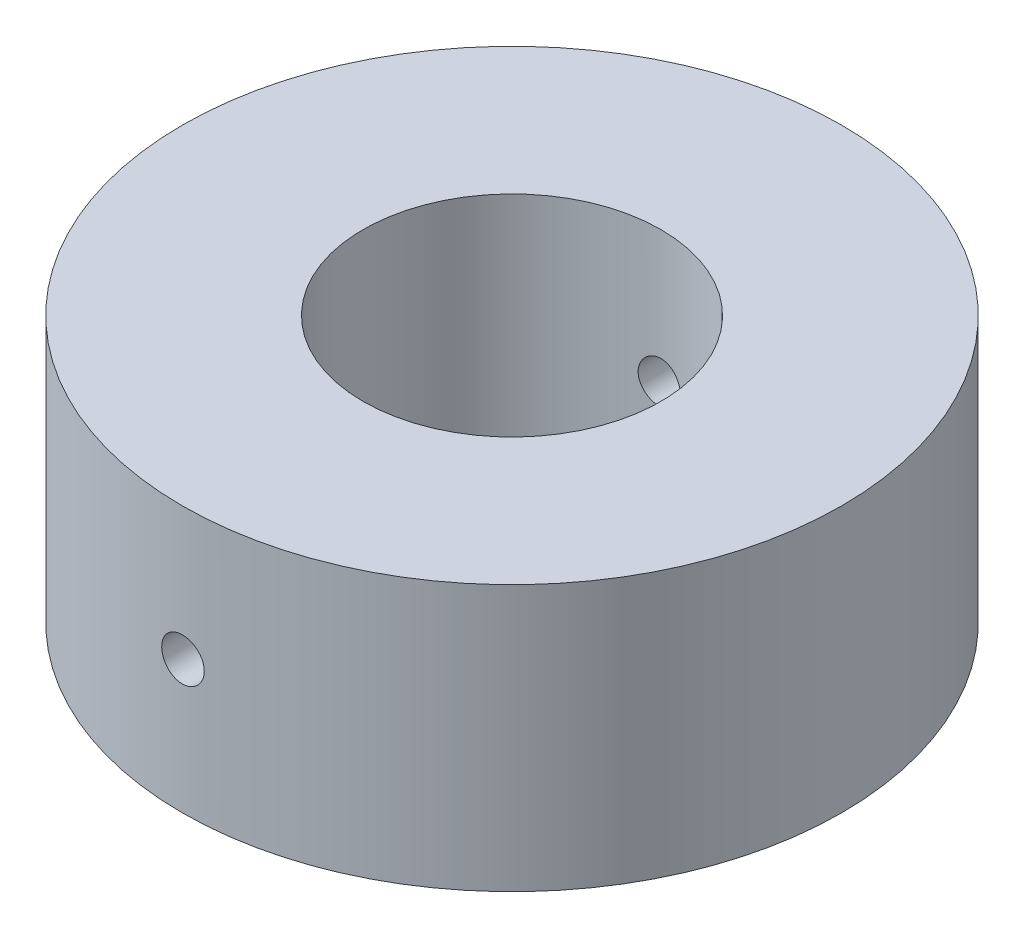
ISO-10303-21;
HEADER;
FILE_DESCRIPTION(('STEP AP214'),'2;1');
FILE_NAME('part.step','',(''),(''),'','','');
FILE_SCHEMA(('AUTOMOTIVE_DESIGN { 1 0 10303 214 1 1 1 1 }'));
ENDSEC;
DATA;
#1=APPLICATION_CONTEXT('core data for automotive mechanical design processes');
#2=APPLICATION_PROTOCOL_DEFINITION('international standard','automotive_design',2000,#1);
#3=PRODUCT_CONTEXT('',#1,'mechanical');
#4=PRODUCT('Part','Part','',(#3));
#5=PRODUCT_RELATED_PRODUCT_CATEGORY('part','',(#4));
#6=PRODUCT_DEFINITION_FORMATION('','',#4);
#7=PRODUCT_DEFINITION_CONTEXT('part definition',#1,'design');
#8=PRODUCT_DEFINITION('design','',#6,#7);
#9=PRODUCT_DEFINITION_SHAPE('','',#8);
#10=(LENGTH_UNIT() NAMED_UNIT(*) SI_UNIT(.MILLI.,.METRE.));
#11=(NAMED_UNIT(*) PLANE_ANGLE_UNIT() SI_UNIT($,.RADIAN.));
#12=(NAMED_UNIT(*) SI_UNIT($,.STERADIAN.) SOLID_ANGLE_UNIT());
#13=UNCERTAINTY_MEASURE_WITH_UNIT(LENGTH_MEASURE(1.E-05),#10,'distance_accuracy_value','');
#14=(GEOMETRIC_REPRESENTATION_CONTEXT(3) GLOBAL_UNCERTAINTY_ASSIGNED_CONTEXT((#13)) GLOBAL_UNIT_ASSIGNED_CONTEXT((#10,
#11,#12)) REPRESENTATION_CONTEXT('',''));
#15=CARTESIAN_POINT('',(0.,0.,0.));
#16=DIRECTION('',(0.,0.,1.));
#17=DIRECTION('',(1.,0.,0.));
#18=AXIS2_PLACEMENT_3D('',#15,#16,#17);
#19=CARTESIAN_POINT('',(0.,-12.5,0.));
#20=DIRECTION('',(0.,1.,0.));
#21=DIRECTION('',(0.,0.,1.));
#22=AXIS2_PLACEMENT_3D('',#19,#20,#21);
#23=PLANE('',#22);
#24=CARTESIAN_POINT('',(0.,-12.5,0.));
#25=DIRECTION('',(0.,1.,0.));
#26=DIRECTION('',(0.,0.,1.));
#27=AXIS2_PLACEMENT_3D('',#24,#25,#26);
#28=CIRCLE('',#27,31.);
#29=CARTESIAN_POINT('',(0.,-12.5,31.));
#30=VERTEX_POINT('',#29);
#31=EDGE_CURVE('E108',#30,#30,#28,.T.);
#32=ORIENTED_EDGE('',*,*,#31,.F.);
#33=EDGE_LOOP('',(#32));
#34=FACE_BOUND('',#33,.T.);
#35=CARTESIAN_POINT('',(0.,-12.5,0.));
#36=DIRECTION('',(0.,-1.,0.));
#37=DIRECTION('',(0.,0.,-1.));
#38=AXIS2_PLACEMENT_3D('',#35,#36,#37);
#39=CIRCLE('',#38,15.025);
#40=CARTESIAN_POINT('',(0.,-12.5,-15.025));
#41=VERTEX_POINT('',#40);
#42=EDGE_CURVE('E111',#41,#41,#39,.T.);
#43=ORIENTED_EDGE('',*,*,#42,.F.);
#44=EDGE_LOOP('',(#43));
#45=FACE_BOUND('',#44,.T.);
#46=ADVANCED_FACE('F49',(#34,#45),#23,.F.);
#47=CARTESIAN_POINT('',(0.,0.,-31.));
#48=DIRECTION('',(0.,0.,1.));
#49=DIRECTION('',(1.,0.,0.));
#50=AXIS2_PLACEMENT_3D('',#47,#48,#49);
#51=CYLINDRICAL_SURFACE('',#50,2.);
#52=CARTESIAN_POINT('',(2.,0.,-13.856406460551));
#53=CARTESIAN_POINT('',(1.99999534115949,0.111724171239718,-13.8564082571265));
#54=CARTESIAN_POINT('',(1.99060664506871,0.223514712772157,-13.8577723197261));
#55=CARTESIAN_POINT('',(1.95330740137887,0.4439746364233,-13.8630779913067));
#56=CARTESIAN_POINT('',(1.92537839621705,0.552640795515153,-13.8670221688303));
#57=CARTESIAN_POINT('',(1.85184738836467,0.763628700028854,-13.8770324264324));
#58=CARTESIAN_POINT('',(1.80625847122079,0.865955078100517,-13.8830969350759));
#59=CARTESIAN_POINT('',(1.69873175889211,1.06148972946806,-13.8966626659811));
#60=CARTESIAN_POINT('',(1.63679637900725,1.15469934704029,-13.9041636759451));
#61=CARTESIAN_POINT('',(1.49785346840196,1.33004829584733,-13.9198182525555));
#62=CARTESIAN_POINT('',(1.42075056427329,1.41211171386589,-13.9279757447273));
#63=CARTESIAN_POINT('',(1.25386707896715,1.56218155724058,-13.9439890311844));
#64=CARTESIAN_POINT('',(1.16408582185113,1.63018723264027,-13.9518448093556));
#65=CARTESIAN_POINT('',(0.973910384020492,1.75048909775968,-13.9664103702289));
#66=CARTESIAN_POINT('',(0.873471766216093,1.80271571451843,-13.9731150229347));
#67=CARTESIAN_POINT('',(0.665136745963097,1.88953073532782,-13.9845795145291));
#68=CARTESIAN_POINT('',(0.55724070203933,1.92411998664739,-13.9893394468364));
#69=CARTESIAN_POINT('',(0.337834063540951,1.97444920696427,-13.9963505000898));
#70=CARTESIAN_POINT('',(0.226353125069878,1.99031606996624,-13.9986185031811));
#71=CARTESIAN_POINT('',(0.00228956527839891,2.0031438985666,-14.0004479548383));
#72=CARTESIAN_POINT('',(-0.110292999940579,2.00010582196611,-14.0000095405223));
#73=CARTESIAN_POINT('',(-0.33249899218587,1.97531062178419,-13.9964890946326));
#74=CARTESIAN_POINT('',(-0.442137999771035,1.95369000111749,-13.9934263413243));
#75=CARTESIAN_POINT('',(-0.656215595128694,1.89255744030079,-13.9850228541263));
#76=CARTESIAN_POINT('',(-0.760654059261884,1.8530450750122,-13.9796820661069));
#77=CARTESIAN_POINT('',(-0.961781966767738,1.75710925521643,-13.9672894037098));
#78=CARTESIAN_POINT('',(-1.05844339279107,1.70062784888116,-13.9602316817171));
#79=CARTESIAN_POINT('',(-1.24096782013765,1.57239950725974,-13.9451926669623));
#80=CARTESIAN_POINT('',(-1.32683017541183,1.50065165935678,-13.9372113189995));
#81=CARTESIAN_POINT('',(-1.48612299106386,1.34316539832401,-13.921132049438));
#82=CARTESIAN_POINT('',(-1.55943569332184,1.25730786725081,-13.9130337231123));
#83=CARTESIAN_POINT('',(-1.69062989590123,1.07444547857052,-13.8977029387566));
#84=CARTESIAN_POINT('',(-1.74851131716179,0.977440563854387,-13.890470485163));
#85=CARTESIAN_POINT('',(-1.84721301520795,0.774919710093822,-13.8776905368292));
#86=CARTESIAN_POINT('',(-1.88802200251778,0.669398194117397,-13.8721441576987));
#87=CARTESIAN_POINT('',(-1.9513062370832,0.452902420174113,-13.8633846580895));
#88=CARTESIAN_POINT('',(-1.97378265080303,0.341928509608439,-13.8601713891613));
#89=CARTESIAN_POINT('',(-1.99960390688194,0.118723462569961,-13.8564698075732));
#90=CARTESIAN_POINT('',(-2.00311531104472,0.0065119740044162,-13.8559577720311));
#91=CARTESIAN_POINT('',(-1.99134808247121,-0.21689780502515,-13.8576537253271));
#92=CARTESIAN_POINT('',(-1.9760699768337,-0.328096123823289,-13.8598616378631));
#93=CARTESIAN_POINT('',(-1.92729837855201,-0.545812180028446,-13.8667269652516));
#94=CARTESIAN_POINT('',(-1.89388715844421,-0.652348727065341,-13.8713733134525));
#95=CARTESIAN_POINT('',(-1.80988306171463,-0.858308797456496,-13.8825829121217));
#96=CARTESIAN_POINT('',(-1.75928940970141,-0.957731999561724,-13.8891462490961));
#97=CARTESIAN_POINT('',(-1.64195360331226,-1.14739187972149,-13.9035064841342));
#98=CARTESIAN_POINT('',(-1.57510320027125,-1.23756096121236,-13.911311524523));
#99=CARTESIAN_POINT('',(-1.42730277821365,-1.40545972362551,-13.9272509086593));
#100=CARTESIAN_POINT('',(-1.34635203820216,-1.48318876805913,-13.9353852692295));
#101=CARTESIAN_POINT('',(-1.17191708628535,-1.6245952184338,-13.9511405241391));
#102=CARTESIAN_POINT('',(-1.07834317212433,-1.68816252231952,-13.9587570956185));
#103=CARTESIAN_POINT('',(-0.881748704771194,-1.79867556313572,-13.972552215598));
#104=CARTESIAN_POINT('',(-0.778728390176455,-1.84562171973795,-13.9787308004049));
#105=CARTESIAN_POINT('',(-0.566515924593931,-1.92138211431572,-13.9889347784444));
#106=CARTESIAN_POINT('',(-0.457345999123928,-1.95025758862749,-13.9929674365722));
#107=CARTESIAN_POINT('',(-0.235645259045785,-1.98925546710661,-13.9984555911653));
#108=CARTESIAN_POINT('',(-0.123114645314278,-1.99937898985385,-13.9999112413524));
#109=CARTESIAN_POINT('',(0.101043130627157,-2.00056023894447,-14.0000800767192));
#110=CARTESIAN_POINT('',(0.212669421750584,-1.99178681901844,-13.9988175502239));
#111=CARTESIAN_POINT('',(0.432842633479872,-1.95578384995697,-13.9937406427504));
#112=CARTESIAN_POINT('',(0.541389561355442,-1.92855434439613,-13.989926267797));
#113=CARTESIAN_POINT('',(0.752283714497251,-1.85647002257181,-13.9801722205425));
#114=CARTESIAN_POINT('',(0.854634630206985,-1.81162581951526,-13.9742338281966));
#115=CARTESIAN_POINT('',(1.05038570585148,-1.70560285079797,-13.9608856010229));
#116=CARTESIAN_POINT('',(1.14378562996655,-1.64442365494189,-13.9534757274438));
#117=CARTESIAN_POINT('',(1.31984194960265,-1.50685228477663,-13.9379304746346));
#118=CARTESIAN_POINT('',(1.40240016631986,-1.4303350931675,-13.9297894585903));
#119=CARTESIAN_POINT('',(1.55356716727243,-1.2645224397647,-13.9137422342621));
#120=CARTESIAN_POINT('',(1.6221726663073,-1.17522397700347,-13.9058360816507));
#121=CARTESIAN_POINT('',(1.74379523475593,-0.985854561664355,-13.8911108785174));
#122=CARTESIAN_POINT('',(1.79673154300995,-0.885731309588877,-13.8842975402726));
#123=CARTESIAN_POINT('',(1.88495902507096,-0.67796770339548,-13.8725962813595));
#124=CARTESIAN_POINT('',(1.92026877922144,-0.570335401682811,-13.8677063343816));
#125=CARTESIAN_POINT('',(1.96409255165575,-0.385163574169463,-13.8615529221772));
#126=CARTESIAN_POINT('',(1.97753762529532,-0.308775664589437,-13.859633039894));
#127=CARTESIAN_POINT('',(1.99549291508544,-0.154935803034168,-13.857059193163));
#128=CARTESIAN_POINT('',(2.00000323103726,-0.0774838629538774,-13.8564052145753));
#129=CARTESIAN_POINT('',(2.,0.,-13.856406460551));
#130=B_SPLINE_CURVE_WITH_KNOTS('',3,(#52,#53,#54,#55,#56,#57,#58,#59,#60,#61,#62,#63,#64,#65,
#66,#67,#68,#69,#70,#71,#72,#73,#74,#75,#76,#77,#78,#79,#80,#81,#82,#83,#84,#85,#86,#87,#88,#89,
#90,#91,#92,#93,#94,#95,#96,#97,#98,#99,#100,#101,#102,#103,#104,#105,#106,#107,#108,#109,#110,
#111,#112,#113,#114,#115,#116,#117,#118,#119,#120,#121,#122,#123,#124,#125,#126,#127,#128,#129),
.UNSPECIFIED.,.T.,.F.,(4,2,2,2,2,2,2,2,2,2,2,2,2,2,2,2,2,2,2,2,2,2,2,2,2,2,2,2,2,2,2,2,2,2,2,2,
2,2,4),(0.,0.334889349408973,0.670112594526281,1.00508792139358,1.34001378108308,
1.6771171564902,2.01423851114537,2.35282530676003,2.6913958357102,3.02765822138618,
3.36390357078099,3.69769984907442,4.03150405935711,4.36646147641386,4.70143892261039,
5.03940517986243,5.37737316862278,5.7155642933107,6.05373389790875,6.3889286108256,
6.72411392079905,7.05779100804298,7.39148315513125,7.72746121011463,8.06345644976601,
8.40197921522166,8.74049343261658,9.07785422138908,9.41519488547502,9.74953375304066,
10.083871831239,10.4180087723112,10.7521545140199,11.0891434930866,11.426211725383,
11.7649881551454,12.103406718889,12.3356645196522,12.5679197260806),.UNSPECIFIED.);
#131=CARTESIAN_POINT('',(2.,0.,-13.856406460551));
#132=VERTEX_POINT('',#131);
#133=EDGE_CURVE('E54',#132,#132,#130,.T.);
#134=ORIENTED_EDGE('',*,*,#133,.T.);
#135=EDGE_LOOP('',(#134));
#136=FACE_BOUND('',#135,.T.);
#137=CARTESIAN_POINT('',(0.,2.,-31.));
#138=CARTESIAN_POINT('',(-0.112215654339317,1.99999506535687,-30.9999991433593));
#139=CARTESIAN_POINT('',(-0.224509697755792,1.99052399692905,-30.9993841781378));
#140=CARTESIAN_POINT('',(-0.445996563839363,1.95287826523691,-30.9969900822698));
#141=CARTESIAN_POINT('',(-0.555185631317145,1.92468188148123,-30.995209599712));
#142=CARTESIAN_POINT('',(-0.767222273353349,1.85039922266924,-30.9906858712334));
#143=CARTESIAN_POINT('',(-0.870073180121544,1.804322442615,-30.9879431363702));
#144=CARTESIAN_POINT('',(-1.06655419121177,1.69560247432647,-30.9818033083145));
#145=CARTESIAN_POINT('',(-1.16018638881332,1.63296305890811,-30.9784063641926));
#146=CARTESIAN_POINT('',(-1.33574735149226,1.49278721689289,-30.9713338678515));
#147=CARTESIAN_POINT('',(-1.41765955134849,1.41523006107196,-30.9676579323087));
#148=CARTESIAN_POINT('',(-1.56731361668946,1.24746315936059,-30.9604450194385));
#149=CARTESIAN_POINT('',(-1.63505488757192,1.15725288281922,-30.9569080479471));
#150=CARTESIAN_POINT('',(-1.75449583012476,0.966645876772271,-30.9503689553142));
#151=CARTESIAN_POINT('',(-1.80618164293255,0.866240445574872,-30.9473672971948));
#152=CARTESIAN_POINT('',(-1.89195583963109,0.658154240871173,-30.9422423248965));
#153=CARTESIAN_POINT('',(-1.92604442295615,0.550473549833064,-30.9401190007632));
#154=CARTESIAN_POINT('',(-1.97561027708406,0.331053889731196,-30.9369938163707));
#155=CARTESIAN_POINT('',(-1.99111363037516,0.219320835321083,-30.9359903845927));
#156=CARTESIAN_POINT('',(-2.00314946286492,-0.0051658867761137,-30.9352134372475));
#157=CARTESIAN_POINT('',(-1.99968216879705,-0.117919542249094,-30.9354399069807));
#158=CARTESIAN_POINT('',(-1.97389676609058,-0.341068993309128,-30.9370957648353));
#159=CARTESIAN_POINT('',(-1.95160689250421,-0.451468066745859,-30.9385233511946));
#160=CARTESIAN_POINT('',(-1.88885285922539,-0.666954436312708,-30.9424177285383));
#161=CARTESIAN_POINT('',(-1.84838858481581,-0.772041698909924,-30.9448845260822));
#162=CARTESIAN_POINT('',(-1.75040236603017,-0.974012051523738,-30.950581411863));
#163=CARTESIAN_POINT('',(-1.69286762529808,-1.07088891657466,-30.9538120723364));
#164=CARTESIAN_POINT('',(-1.56238294303282,-1.25362043754488,-30.9606720468822));
#165=CARTESIAN_POINT('',(-1.48943281646507,-1.33947496114047,-30.9643013657397));
#166=CARTESIAN_POINT('',(-1.33002918024156,-1.49788897224725,-30.9715576661216));
#167=CARTESIAN_POINT('',(-1.24355123701299,-1.57042387657725,-30.9751846312538));
#168=CARTESIAN_POINT('',(-1.05963238065177,-1.69994998940823,-30.9820211258603));
#169=CARTESIAN_POINT('',(-0.96219146344964,-1.75694119213933,-30.9852306551797));
#170=CARTESIAN_POINT('',(-0.759097650104713,-1.85376009536345,-30.9908708984537));
#171=CARTESIAN_POINT('',(-0.653444302495537,-1.89358685147729,-30.993301569554));
#172=CARTESIAN_POINT('',(-0.43693145704657,-1.95492983719797,-30.9971096301203));
#173=CARTESIAN_POINT('',(-0.326072024003265,-1.97644629463654,-30.9984870326917));
#174=CARTESIAN_POINT('',(-0.102507175447048,-2.00052741791093,-31.0000316586496));
#175=CARTESIAN_POINT('',(0.010194564986633,-2.00312606946162,-31.0002010522052));
#176=CARTESIAN_POINT('',(0.234432325673386,-1.98938663363241,-30.9993163465974));
#177=CARTESIAN_POINT('',(0.345968352392935,-1.97304865135459,-30.9982622542246));
#178=CARTESIAN_POINT('',(0.564612747016006,-1.9219278659019,-30.9950506275521));
#179=CARTESIAN_POINT('',(0.671724778633497,-1.88716066890227,-30.9928940269301));
#180=CARTESIAN_POINT('',(0.878593779219436,-1.80018422535197,-30.9877199775486));
#181=CARTESIAN_POINT('',(0.978350677728702,-1.74797481173847,-30.9847025205438));
#182=CARTESIAN_POINT('',(1.1678332297321,-1.62750954769242,-30.9781403346066));
#183=CARTESIAN_POINT('',(1.25754443633822,-1.55923101448261,-30.9745948629635));
#184=CARTESIAN_POINT('',(1.42424356495627,-1.40859868348154,-30.967378088537));
#185=CARTESIAN_POINT('',(1.50123135368358,-1.32624473826119,-30.9637067844358));
#186=CARTESIAN_POINT('',(1.64041349295417,-1.14965261108097,-30.9566458285136));
#187=CARTESIAN_POINT('',(1.7025857840609,-1.05539702354022,-30.9532566015118));
#188=CARTESIAN_POINT('',(1.81022116069945,-0.857764592436426,-30.9471487879795));
#189=CARTESIAN_POINT('',(1.85568435473854,-0.75438780811097,-30.944430197094));
#190=CARTESIAN_POINT('',(1.92857285757611,-0.541527836801464,-30.9399733092594));
#191=CARTESIAN_POINT('',(1.95601201841901,-0.432049409492469,-30.9382342596483));
#192=CARTESIAN_POINT('',(1.99211878627912,-0.210027804712064,-30.9359304876033));
#193=CARTESIAN_POINT('',(2.00078659418242,-0.0974846600515063,-30.9353657526022));
#194=CARTESIAN_POINT('',(1.99910264494747,0.127252361480456,-30.9354746011268));
#195=CARTESIAN_POINT('',(1.98878556636566,0.239446500937189,-30.9361459268157));
#196=CARTESIAN_POINT('',(1.94949664150648,0.46050581969475,-30.938646462886));
#197=CARTESIAN_POINT('',(1.92052476179849,0.569370993029489,-30.9404756753424));
#198=CARTESIAN_POINT('',(1.84475653861325,0.780687053413475,-30.9450852959292));
#199=CARTESIAN_POINT('',(1.79796038157477,0.883138007541266,-30.9478656941104));
#200=CARTESIAN_POINT('',(1.68787663618787,1.07873362067521,-30.9540643267455));
#201=CARTESIAN_POINT('',(1.62458946071716,1.17187851259202,-30.95748254523));
#202=CARTESIAN_POINT('',(1.48319164247164,1.34639404083785,-30.9645789238549));
#203=CARTESIAN_POINT('',(1.40505584730704,1.42774427966753,-30.9682575183188));
#204=CARTESIAN_POINT('',(1.23621411924608,1.57620195213939,-30.9754563916217));
#205=CARTESIAN_POINT('',(1.1455051185099,1.64330589956448,-30.9789766315441));
#206=CARTESIAN_POINT('',(0.953982679662096,1.76141890870672,-30.9854660027973));
#207=CARTESIAN_POINT('',(0.853156370464058,1.81240711726672,-30.9884344180602));
#208=CARTESIAN_POINT('',(0.644427767747333,1.89666848162457,-30.9934761838017));
#209=CARTESIAN_POINT('',(0.536533915357341,1.92996235248338,-30.9955505803825));
#210=CARTESIAN_POINT('',(0.356651594381852,1.96925124704238,-30.9980279003735));
#211=CARTESIAN_POINT('',(0.285825407491095,1.98076708436121,-30.9987641443571));
#212=CARTESIAN_POINT('',(0.143343476839127,1.99614303138479,-30.9997504674376));
#213=CARTESIAN_POINT('',(0.0716877343082421,2.00000315244239,-31.0000005472555));
#214=CARTESIAN_POINT('',(0.,2.,-31.));
#215=B_SPLINE_CURVE_WITH_KNOTS('',3,(#137,#138,#139,#140,#141,#142,#143,#144,#145,#146,#147,
#148,#149,#150,#151,#152,#153,#154,#155,#156,#157,#158,#159,#160,#161,#162,#163,#164,#165,#166,
#167,#168,#169,#170,#171,#172,#173,#174,#175,#176,#177,#178,#179,#180,#181,#182,#183,#184,#185,
#186,#187,#188,#189,#190,#191,#192,#193,#194,#195,#196,#197,#198,#199,#200,#201,#202,#203,#204,
#205,#206,#207,#208,#209,#210,#211,#212,#213,#214),.UNSPECIFIED.,.T.,.F.,(4,2,2,2,2,2,2,2,2,2,2,
2,2,2,2,2,2,2,2,2,2,2,2,2,2,2,2,2,2,2,2,2,2,2,2,2,2,2,4),(0.,0.336385257264421,
0.673161388839542,1.00975892684098,1.34627985697648,1.68327182913147,2.02027793839952,
2.35757414376299,2.69486652637059,3.031684997043,3.36849944213587,3.70480954006273,
4.04112176081471,4.37768672750882,4.71425573430237,5.05143981525635,5.38862402137422,
5.72582677682908,6.06302533646995,6.39961797126436,6.73620873791161,7.07251492800511,
7.40882433935654,7.74561135475004,8.08240189794396,8.41969081298249,8.75697753766028,
9.09400474250684,9.43102834055903,9.7674369287722,10.1038461198529,10.4402517922498,
10.7766490430285,11.113621287119,11.450675897049,11.7881648741284,12.1252578719076,
12.3401542056707,12.5550502207584),.UNSPECIFIED.);
#216=CARTESIAN_POINT('',(0.,2.,-31.));
#217=VERTEX_POINT('',#216);
#218=EDGE_CURVE('E10',#217,#217,#215,.T.);
#219=ORIENTED_EDGE('',*,*,#218,.F.);
#220=EDGE_LOOP('',(#219));
#221=FACE_BOUND('',#220,.T.);
#222=ADVANCED_FACE('F90',(#136,#221),#51,.F.);
#223=CARTESIAN_POINT('',(0.,12.5,0.));
#224=DIRECTION('',(0.,-1.,0.));
#225=DIRECTION('',(0.,0.,-1.));
#226=AXIS2_PLACEMENT_3D('',#223,#224,#225);
#227=CYLINDRICAL_SURFACE('',#226,31.);
#228=ORIENTED_EDGE('',*,*,#218,.T.);
#229=EDGE_LOOP('',(#228));
#230=FACE_BOUND('',#229,.T.);
#231=CARTESIAN_POINT('',(2.,0.,30.935416596516));
#232=CARTESIAN_POINT('',(1.9999950651086,-0.112215380274018,30.9354174598263));
#233=CARTESIAN_POINT('',(1.99052404137826,-0.224509150543306,30.9360337396535));
#234=CARTESIAN_POINT('',(1.95287850337883,-0.445995449071102,30.9384325324618));
#235=CARTESIAN_POINT('',(1.92468226768592,-0.555184221926338,30.9402163998208));
#236=CARTESIAN_POINT('',(1.85040004205521,-0.767220241139664,30.9447474731823));
#237=CARTESIAN_POINT('',(1.80432355417806,-0.870070822202982,30.947494167437));
#238=CARTESIAN_POINT('',(1.69560427382128,-1.0665512881791,30.95364075921));
#239=CARTESIAN_POINT('',(1.63296525343412,-1.16018326596018,30.9570405079479));
#240=CARTESIAN_POINT('',(1.49278980939589,-1.33574447939923,30.964116258183));
#241=CARTESIAN_POINT('',(1.41523256837066,-1.41765707960332,30.9677926412884));
#242=CARTESIAN_POINT('',(1.24746532849986,-1.56731191689312,30.9750038722733));
#243=CARTESIAN_POINT('',(1.15725480009166,-1.63505356060327,30.978538714221));
#244=CARTESIAN_POINT('',(0.966647575892431,-1.75449489103906,30.9850718865194));
#245=CARTESIAN_POINT('',(0.86624222169945,-1.80618078792872,30.988069754748));
#246=CARTESIAN_POINT('',(0.658156184429077,-1.89195516135706,30.9931871662127));
#247=CARTESIAN_POINT('',(0.550475583400461,-1.92604383631625,30.9953067193523));
#248=CARTESIAN_POINT('',(0.331056188607279,-1.97560988486416,30.9984260427323));
#249=CARTESIAN_POINT('',(0.219323311030999,-1.99111334795072,30.9994273825597));
#250=CARTESIAN_POINT('',(-0.00516306558923811,-2.00314946128935,31.0002027404449));
#251=CARTESIAN_POINT('',(-0.117916552481839,-1.99968233710906,30.999976773096));
#252=CARTESIAN_POINT('',(-0.341066758562419,-1.97389720121747,30.9983242869808));
#253=CARTESIAN_POINT('',(-0.451466735643611,-1.95160725360552,30.9968995555366));
#254=CARTESIAN_POINT('',(-0.666954874354031,-1.88885275820205,30.9930119874225));
#255=CARTESIAN_POINT('',(-0.772043002934536,-1.84838809734843,30.9905491442946));
#256=CARTESIAN_POINT('',(-0.974014396906491,-1.75040108286936,30.9848595560919));
#257=CARTESIAN_POINT('',(-1.07089148154328,-1.69286602379006,30.9816322423855));
#258=CARTESIAN_POINT('',(-1.25362330624744,-1.56238066445803,30.9747768773151));
#259=CARTESIAN_POINT('',(-1.33947791385398,-1.48943017898078,30.9711488211361));
#260=CARTESIAN_POINT('',(-1.49789151150326,-1.33002629083235,30.9638924303215));
#261=CARTESIAN_POINT('',(-1.57042599106083,-1.24354852718224,30.9602641072233));
#262=CARTESIAN_POINT('',(-1.69995133281391,-1.05963018049244,30.9534228462431));
#263=CARTESIAN_POINT('',(-1.75694218838106,-0.962189592777827,30.9502099085383));
#264=CARTESIAN_POINT('',(-1.85376084284193,-0.759095863019263,30.9445622747552));
#265=CARTESIAN_POINT('',(-1.89358758916401,-0.653442217786696,30.9421276264072));
#266=CARTESIAN_POINT('',(-1.95493046384886,-0.43692872627003,30.9383128117028));
#267=CARTESIAN_POINT('',(-1.97644682181494,-0.326068945286724,30.936932632124));
#268=CARTESIAN_POINT('',(-2.0005275707802,-0.102503943922515,30.935384882819));
#269=CARTESIAN_POINT('',(-2.00312604181521,0.0101975911755167,30.9352151325502));
#270=CARTESIAN_POINT('',(-1.98938631826897,0.234434897624129,30.9361016877302));
#271=CARTESIAN_POINT('',(-1.97304822877741,0.34597067544069,30.9371579863749));
#272=CARTESIAN_POINT('',(-1.92192748105391,0.564613877756942,30.9403756121162));
#273=CARTESIAN_POINT('',(-1.8871605360573,0.671724991175506,30.9425359977644));
#274=CARTESIAN_POINT('',(-1.80018490459517,0.878592267099568,30.9477175452393));
#275=CARTESIAN_POINT('',(-1.747976049591,0.978348358523185,30.9507387153836));
#276=CARTESIAN_POINT('',(-1.62751159980918,1.16783037459035,30.9573066672382));
#277=CARTESIAN_POINT('',(-1.55923318016581,1.25754176197363,30.9608541939005));
#278=CARTESIAN_POINT('',(-1.40860097350461,1.42424130835709,30.9680724918238));
#279=CARTESIAN_POINT('',(-1.32624703991388,1.50122933484836,30.971743264368));
#280=CARTESIAN_POINT('',(-1.14965480608523,1.64041196801604,30.978800801216));
#281=CARTESIAN_POINT('',(-1.05539909876503,1.70258451359321,30.9821871371824));
#282=CARTESIAN_POINT('',(-0.857766362133938,1.81022033712454,30.9882880741929));
#283=CARTESIAN_POINT('',(-0.754389392075748,1.85568372361327,30.9910026796002));
#284=CARTESIAN_POINT('',(-0.541529554165107,1.92857235817444,30.995452244892));
#285=CARTESIAN_POINT('',(-0.432051474572318,1.95601154157408,30.9971879614524));
#286=CARTESIAN_POINT('',(-0.210030601522678,1.9921184724407,30.9994871962382));
#287=CARTESIAN_POINT('',(-0.0974878405751338,2.00078641894939,31.0000507268929));
#288=CARTESIAN_POINT('',(0.127249434817581,1.99910286557703,30.9999421302566));
#289=CARTESIAN_POINT('',(0.239444210521209,1.98878587873795,30.9992722452123));
#290=CARTESIAN_POINT('',(0.460504824177758,1.94949691314283,30.996776591382));
#291=CARTESIAN_POINT('',(0.569370656367646,1.92052490209332,30.9949508205951));
#292=CARTESIAN_POINT('',(0.780688007245924,1.84475617702917,30.9903485785737));
#293=CARTESIAN_POINT('',(0.883139592421462,1.79795964781096,30.9875721171954));
#294=CARTESIAN_POINT('',(1.07873631173732,1.68787496339571,30.981380132641));
#295=CARTESIAN_POINT('',(1.17188167917674,1.62458722176319,30.9779646254913));
#296=CARTESIAN_POINT('',(1.34639715713101,1.48318879026244,30.9708712939515));
#297=CARTESIAN_POINT('',(1.42774697433475,1.40505307681295,30.9671930333646));
#298=CARTESIAN_POINT('',(1.57620383440594,1.23621168433263,30.9599922696012));
#299=CARTESIAN_POINT('',(1.64330738996597,1.14550293654076,30.9564698047282));
#300=CARTESIAN_POINT('',(1.76141998814996,0.953980694172997,30.9499743793539));
#301=CARTESIAN_POINT('',(1.81240810435309,0.853154283366623,30.9470021353891));
#302=CARTESIAN_POINT('',(1.89666926769398,0.644425463254457,30.9419528171104));
#303=CARTESIAN_POINT('',(1.92996303129094,0.536531495667232,30.939874696507));
#304=CARTESIAN_POINT('',(1.96925161658879,0.356649462814186,30.9373926932198));
#305=CARTESIAN_POINT('',(1.98076731488728,0.285823701110222,30.9366549763298));
#306=CARTESIAN_POINT('',(1.99614307717099,0.143342622753848,30.9356666525845));
#307=CARTESIAN_POINT('',(2.00000315258992,0.071687307340542,30.9354160450018));
#308=CARTESIAN_POINT('',(2.,0.,30.935416596516));
#309=B_SPLINE_CURVE_WITH_KNOTS('',3,(#231,#232,#233,#234,#235,#236,#237,#238,#239,#240,#241,
#242,#243,#244,#245,#246,#247,#248,#249,#250,#251,#252,#253,#254,#255,#256,#257,#258,#259,#260,
#261,#262,#263,#264,#265,#266,#267,#268,#269,#270,#271,#272,#273,#274,#275,#276,#277,#278,#279,
#280,#281,#282,#283,#284,#285,#286,#287,#288,#289,#290,#291,#292,#293,#294,#295,#296,#297,#298,
#299,#300,#301,#302,#303,#304,#305,#306,#307,#308),.UNSPECIFIED.,.T.,.F.,(4,2,2,2,2,2,2,2,2,2,2,
2,2,2,2,2,2,2,2,2,2,2,2,2,2,2,2,2,2,2,2,2,2,2,2,2,2,2,4),(0.,0.336384434145965,
0.673159760617527,1.00975635991943,1.34627636577083,1.6832694147909,2.02027657178112,
2.35757237967898,2.69486438425706,3.03168234945043,3.36849630975605,3.70480897835091,
4.04112373912456,4.3776894487685,4.71425920265772,5.05144220790365,5.38862535693606,
5.72582918044264,6.06302877551573,6.3996207644428,6.73621088543929,7.07251447576487,
7.40882131583729,7.74560875292195,8.08239969729702,8.41968905198688,8.75697621577017,
9.09400229968929,9.43102480991879,9.76743524621643,10.1038462648715,10.4402537958664,
10.7766528912881,11.1136240372166,11.4506775746187,11.7881670057116,12.1252604305222,
12.3401554856518,12.5550502198345),.UNSPECIFIED.);
#310=CARTESIAN_POINT('',(2.,0.,30.935416596516));
#311=VERTEX_POINT('',#310);
#312=EDGE_CURVE('E64',#311,#311,#309,.T.);
#313=ORIENTED_EDGE('',*,*,#312,.T.);
#314=EDGE_LOOP('',(#313));
#315=FACE_BOUND('',#314,.T.);
#316=CARTESIAN_POINT('',(0.,12.5,0.));
#317=DIRECTION('',(0.,1.,0.));
#318=DIRECTION('',(0.,0.,1.));
#319=AXIS2_PLACEMENT_3D('',#316,#317,#318);
#320=CIRCLE('',#319,31.);
#321=CARTESIAN_POINT('',(0.,12.5,31.));
#322=VERTEX_POINT('',#321);
#323=EDGE_CURVE('E70',#322,#322,#320,.T.);
#324=ORIENTED_EDGE('',*,*,#323,.F.);
#325=EDGE_LOOP('',(#324));
#326=FACE_BOUND('',#325,.T.);
#327=ORIENTED_EDGE('',*,*,#31,.T.);
#328=EDGE_LOOP('',(#327));
#329=FACE_BOUND('',#328,.T.);
#330=ADVANCED_FACE('F51',(#230,#315,#326,#329),#227,.T.);
#331=CARTESIAN_POINT('',(0.,12.5,0.));
#332=DIRECTION('',(0.,1.,0.));
#333=DIRECTION('',(0.,0.,1.));
#334=AXIS2_PLACEMENT_3D('',#331,#332,#333);
#335=PLANE('',#334);
#336=CARTESIAN_POINT('',(0.,12.5,0.));
#337=DIRECTION('',(0.,-1.,0.));
#338=DIRECTION('',(0.,0.,-1.));
#339=AXIS2_PLACEMENT_3D('',#336,#337,#338);
#340=CIRCLE('',#339,14.);
#341=CARTESIAN_POINT('',(0.,12.5,-14.));
#342=VERTEX_POINT('',#341);
#343=EDGE_CURVE('E118',#342,#342,#340,.T.);
#344=ORIENTED_EDGE('',*,*,#343,.T.);
#345=EDGE_LOOP('',(#344));
#346=FACE_BOUND('',#345,.T.);
#347=ORIENTED_EDGE('',*,*,#323,.T.);
#348=EDGE_LOOP('',(#347));
#349=FACE_BOUND('',#348,.T.);
#350=ADVANCED_FACE('F88',(#346,#349),#335,.T.);
#351=CARTESIAN_POINT('',(2.,0.,13.856406460551));
#352=CARTESIAN_POINT('',(1.99999534115949,-0.111724171239718,13.8564082571265));
#353=CARTESIAN_POINT('',(1.99060664506871,-0.223514712772157,13.8577723197261));
#354=CARTESIAN_POINT('',(1.95330740137887,-0.4439746364233,13.8630779913067));
#355=CARTESIAN_POINT('',(1.92537839621705,-0.552640795515153,13.8670221688303));
#356=CARTESIAN_POINT('',(1.85184738836467,-0.763628700028854,13.8770324264324));
#357=CARTESIAN_POINT('',(1.80625847122079,-0.865955078100517,13.8830969350759));
#358=CARTESIAN_POINT('',(1.69873175889211,-1.06148972946806,13.8966626659811));
#359=CARTESIAN_POINT('',(1.63679637900725,-1.15469934704029,13.9041636759451));
#360=CARTESIAN_POINT('',(1.49785346840196,-1.33004829584733,13.9198182525555));
#361=CARTESIAN_POINT('',(1.42075056427329,-1.41211171386589,13.9279757447273));
#362=CARTESIAN_POINT('',(1.25386707896715,-1.56218155724058,13.9439890311844));
#363=CARTESIAN_POINT('',(1.16408582185113,-1.63018723264027,13.9518448093556));
#364=CARTESIAN_POINT('',(0.973910384020492,-1.75048909775968,13.9664103702289));
#365=CARTESIAN_POINT('',(0.873471766216093,-1.80271571451843,13.9731150229347));
#366=CARTESIAN_POINT('',(0.665136745963097,-1.88953073532782,13.9845795145291));
#367=CARTESIAN_POINT('',(0.55724070203933,-1.92411998664739,13.9893394468364));
#368=CARTESIAN_POINT('',(0.337834063540951,-1.97444920696427,13.9963505000898));
#369=CARTESIAN_POINT('',(0.226353125069878,-1.99031606996624,13.9986185031811));
#370=CARTESIAN_POINT('',(0.00228956527839891,-2.0031438985666,14.0004479548383));
#371=CARTESIAN_POINT('',(-0.110292999940579,-2.00010582196611,14.0000095405223));
#372=CARTESIAN_POINT('',(-0.33249899218587,-1.97531062178419,13.9964890946326));
#373=CARTESIAN_POINT('',(-0.442137999771035,-1.95369000111749,13.9934263413243));
#374=CARTESIAN_POINT('',(-0.656215595128694,-1.89255744030079,13.9850228541263));
#375=CARTESIAN_POINT('',(-0.760654059261884,-1.8530450750122,13.9796820661069));
#376=CARTESIAN_POINT('',(-0.961781966767738,-1.75710925521643,13.9672894037098));
#377=CARTESIAN_POINT('',(-1.05844339279107,-1.70062784888116,13.9602316817171));
#378=CARTESIAN_POINT('',(-1.24096782013765,-1.57239950725974,13.9451926669623));
#379=CARTESIAN_POINT('',(-1.32683017541183,-1.50065165935678,13.9372113189995));
#380=CARTESIAN_POINT('',(-1.48612299106386,-1.34316539832401,13.921132049438));
#381=CARTESIAN_POINT('',(-1.55943569332184,-1.25730786725081,13.9130337231123));
#382=CARTESIAN_POINT('',(-1.69062989590123,-1.07444547857052,13.8977029387566));
#383=CARTESIAN_POINT('',(-1.74851131716179,-0.977440563854387,13.890470485163));
#384=CARTESIAN_POINT('',(-1.84721301520795,-0.774919710093822,13.8776905368292));
#385=CARTESIAN_POINT('',(-1.88802200251778,-0.669398194117397,13.8721441576987));
#386=CARTESIAN_POINT('',(-1.9513062370832,-0.452902420174113,13.8633846580895));
#387=CARTESIAN_POINT('',(-1.97378265080303,-0.341928509608439,13.8601713891613));
#388=CARTESIAN_POINT('',(-1.99960390688194,-0.118723462569961,13.8564698075732));
#389=CARTESIAN_POINT('',(-2.00311531104472,-0.0065119740044162,13.8559577720311));
#390=CARTESIAN_POINT('',(-1.99134808247121,0.21689780502515,13.8576537253271));
#391=CARTESIAN_POINT('',(-1.9760699768337,0.328096123823289,13.8598616378631));
#392=CARTESIAN_POINT('',(-1.92729837855201,0.545812180028446,13.8667269652516));
#393=CARTESIAN_POINT('',(-1.89388715844421,0.652348727065341,13.8713733134525));
#394=CARTESIAN_POINT('',(-1.80988306171463,0.858308797456496,13.8825829121217));
#395=CARTESIAN_POINT('',(-1.75928940970141,0.957731999561724,13.8891462490961));
#396=CARTESIAN_POINT('',(-1.64195360331226,1.14739187972149,13.9035064841342));
#397=CARTESIAN_POINT('',(-1.57510320027125,1.23756096121236,13.911311524523));
#398=CARTESIAN_POINT('',(-1.42730277821365,1.40545972362551,13.9272509086593));
#399=CARTESIAN_POINT('',(-1.34635203820216,1.48318876805913,13.9353852692295));
#400=CARTESIAN_POINT('',(-1.17191708628535,1.6245952184338,13.9511405241391));
#401=CARTESIAN_POINT('',(-1.07834317212433,1.68816252231952,13.9587570956185));
#402=CARTESIAN_POINT('',(-0.881748704771194,1.79867556313572,13.972552215598));
#403=CARTESIAN_POINT('',(-0.778728390176455,1.84562171973795,13.9787308004049));
#404=CARTESIAN_POINT('',(-0.566515924593931,1.92138211431572,13.9889347784444));
#405=CARTESIAN_POINT('',(-0.457345999123928,1.95025758862749,13.9929674365722));
#406=CARTESIAN_POINT('',(-0.235645259045785,1.98925546710661,13.9984555911653));
#407=CARTESIAN_POINT('',(-0.123114645314278,1.99937898985385,13.9999112413524));
#408=CARTESIAN_POINT('',(0.101043130627157,2.00056023894447,14.0000800767192));
#409=CARTESIAN_POINT('',(0.212669421750584,1.99178681901844,13.9988175502239));
#410=CARTESIAN_POINT('',(0.432842633479872,1.95578384995697,13.9937406427504));
#411=CARTESIAN_POINT('',(0.541389561355442,1.92855434439613,13.989926267797));
#412=CARTESIAN_POINT('',(0.752283714497251,1.85647002257181,13.9801722205425));
#413=CARTESIAN_POINT('',(0.854634630206985,1.81162581951526,13.9742338281966));
#414=CARTESIAN_POINT('',(1.05038570585148,1.70560285079797,13.9608856010229));
#415=CARTESIAN_POINT('',(1.14378562996655,1.64442365494189,13.9534757274438));
#416=CARTESIAN_POINT('',(1.31984194960265,1.50685228477663,13.9379304746346));
#417=CARTESIAN_POINT('',(1.40240016631986,1.4303350931675,13.9297894585903));
#418=CARTESIAN_POINT('',(1.55356716727243,1.2645224397647,13.9137422342621));
#419=CARTESIAN_POINT('',(1.6221726663073,1.17522397700347,13.9058360816507));
#420=CARTESIAN_POINT('',(1.74379523475593,0.985854561664355,13.8911108785174));
#421=CARTESIAN_POINT('',(1.79673154300995,0.885731309588877,13.8842975402726));
#422=CARTESIAN_POINT('',(1.88495902507096,0.67796770339548,13.8725962813595));
#423=CARTESIAN_POINT('',(1.92026877922144,0.570335401682811,13.8677063343816));
#424=CARTESIAN_POINT('',(1.96409255165575,0.385163574169463,13.8615529221772));
#425=CARTESIAN_POINT('',(1.97753762529532,0.308775664589437,13.859633039894));
#426=CARTESIAN_POINT('',(1.99549291508544,0.154935803034168,13.857059193163));
#427=CARTESIAN_POINT('',(2.00000323103726,0.0774838629538774,13.8564052145753));
#428=CARTESIAN_POINT('',(2.,0.,13.856406460551));
#429=B_SPLINE_CURVE_WITH_KNOTS('',3,(#351,#352,#353,#354,#355,#356,#357,#358,#359,#360,#361,
#362,#363,#364,#365,#366,#367,#368,#369,#370,#371,#372,#373,#374,#375,#376,#377,#378,#379,#380,
#381,#382,#383,#384,#385,#386,#387,#388,#389,#390,#391,#392,#393,#394,#395,#396,#397,#398,#399,
#400,#401,#402,#403,#404,#405,#406,#407,#408,#409,#410,#411,#412,#413,#414,#415,#416,#417,#418,
#419,#420,#421,#422,#423,#424,#425,#426,#427,#428),.UNSPECIFIED.,.T.,.F.,(4,2,2,2,2,2,2,2,2,2,2,
2,2,2,2,2,2,2,2,2,2,2,2,2,2,2,2,2,2,2,2,2,2,2,2,2,2,2,4),(0.,0.334889349408973,
0.670112594526281,1.00508792139358,1.34001378108308,1.6771171564902,2.01423851114537,
2.35282530676003,2.6913958357102,3.02765822138618,3.36390357078099,3.69769984907442,
4.03150405935711,4.36646147641386,4.70143892261039,5.03940517986243,5.37737316862278,
5.7155642933107,6.05373389790875,6.3889286108256,6.72411392079905,7.05779100804298,
7.39148315513125,7.72746121011463,8.06345644976601,8.40197921522166,8.74049343261658,
9.07785422138908,9.41519488547502,9.74953375304066,10.083871831239,10.4180087723112,
10.7521545140199,11.0891434930866,11.426211725383,11.7649881551454,12.103406718889,
12.3356645196522,12.5679197260806),.UNSPECIFIED.);
#430=CARTESIAN_POINT('',(2.,0.,13.856406460551));
#431=VERTEX_POINT('',#430);
#432=EDGE_CURVE('E79',#431,#431,#429,.T.);
#433=ORIENTED_EDGE('',*,*,#432,.T.);
#434=EDGE_LOOP('',(#433));
#435=FACE_BOUND('',#434,.T.);
#436=ORIENTED_EDGE('',*,*,#312,.F.);
#437=EDGE_LOOP('',(#436));
#438=FACE_BOUND('',#437,.T.);
#439=ADVANCED_FACE('F83',(#435,#438),#51,.F.);
#440=CARTESIAN_POINT('',(0.,-12.5,0.));
#441=DIRECTION('',(0.,-1.,0.));
#442=DIRECTION('',(0.,0.,-1.));
#443=AXIS2_PLACEMENT_3D('',#440,#441,#442);
#444=CYLINDRICAL_SURFACE('',#443,14.);
#445=ORIENTED_EDGE('',*,*,#432,.F.);
#446=EDGE_LOOP('',(#445));
#447=FACE_BOUND('',#446,.T.);
#448=ORIENTED_EDGE('',*,*,#343,.F.);
#449=EDGE_LOOP('',(#448));
#450=FACE_BOUND('',#449,.T.);
#451=CARTESIAN_POINT('',(0.,-11.475,0.));
#452=DIRECTION('',(0.,-1.,0.));
#453=DIRECTION('',(0.,0.,-1.));
#454=AXIS2_PLACEMENT_3D('',#451,#452,#453);
#455=CIRCLE('',#454,14.);
#456=CARTESIAN_POINT('',(0.,-11.475,-14.));
#457=VERTEX_POINT('',#456);
#458=EDGE_CURVE('E114',#457,#457,#455,.T.);
#459=ORIENTED_EDGE('',*,*,#458,.T.);
#460=EDGE_LOOP('',(#459));
#461=FACE_BOUND('',#460,.T.);
#462=ORIENTED_EDGE('',*,*,#133,.F.);
#463=EDGE_LOOP('',(#462));
#464=FACE_BOUND('',#463,.T.);
#465=ADVANCED_FACE('F87',(#447,#450,#461,#464),#444,.F.);
#466=CARTESIAN_POINT('',(0.,-12.5,0.));
#467=DIRECTION('',(0.,-1.,0.));
#468=DIRECTION('',(0.,0.,-1.));
#469=AXIS2_PLACEMENT_3D('',#466,#467,#468);
#470=CONICAL_SURFACE('',#469,15.025,0.785398163397454);
#471=ORIENTED_EDGE('',*,*,#458,.F.);
#472=EDGE_LOOP('',(#471));
#473=FACE_BOUND('',#472,.T.);
#474=ORIENTED_EDGE('',*,*,#42,.T.);
#475=EDGE_LOOP('',(#474));
#476=FACE_BOUND('',#475,.T.);
#477=ADVANCED_FACE('F138',(#473,#476),#470,.F.);
#478=CLOSED_SHELL('',(#46,#222,#330,#350,#439,#465,#477));
#479=MANIFOLD_SOLID_BREP('B2',#478);
#480=ADVANCED_BREP_SHAPE_REPRESENTATION('',(#18,#479),#14);
#481=SHAPE_DEFINITION_REPRESENTATION(#9,#480);
ENDSEC;
END-ISO-10303-21;
